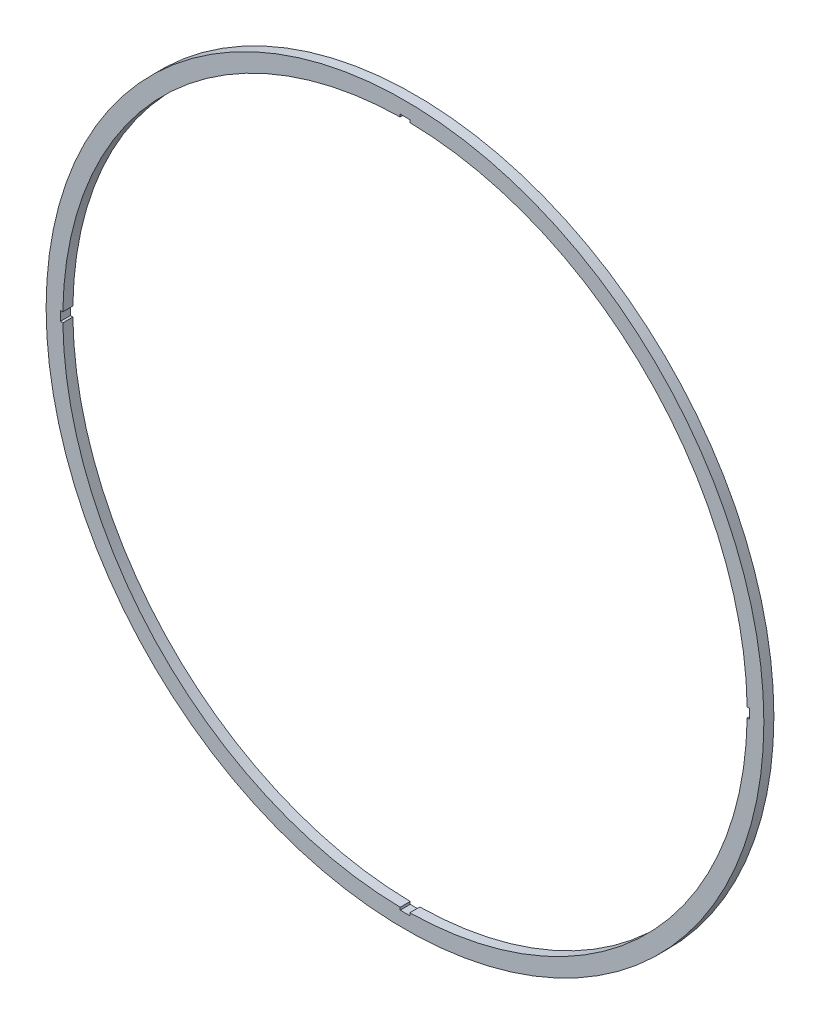
ISO-10303-21;
HEADER;
FILE_DESCRIPTION(('STEP AP214'),'2;1');
FILE_NAME('part.step','',(''),(''),'','','');
FILE_SCHEMA(('AUTOMOTIVE_DESIGN { 1 0 10303 214 1 1 1 1 }'));
ENDSEC;
DATA;
#1=APPLICATION_CONTEXT('core data for automotive mechanical design processes');
#2=APPLICATION_PROTOCOL_DEFINITION('international standard','automotive_design',2000,#1);
#3=PRODUCT_CONTEXT('',#1,'mechanical');
#4=PRODUCT('Part','Part','',(#3));
#5=PRODUCT_RELATED_PRODUCT_CATEGORY('part','',(#4));
#6=PRODUCT_DEFINITION_FORMATION('','',#4);
#7=PRODUCT_DEFINITION_CONTEXT('part definition',#1,'design');
#8=PRODUCT_DEFINITION('design','',#6,#7);
#9=PRODUCT_DEFINITION_SHAPE('','',#8);
#10=(LENGTH_UNIT() NAMED_UNIT(*) SI_UNIT(.MILLI.,.METRE.));
#11=(NAMED_UNIT(*) PLANE_ANGLE_UNIT() SI_UNIT($,.RADIAN.));
#12=(NAMED_UNIT(*) SI_UNIT($,.STERADIAN.) SOLID_ANGLE_UNIT());
#13=UNCERTAINTY_MEASURE_WITH_UNIT(LENGTH_MEASURE(1.E-05),#10,'distance_accuracy_value','');
#14=(GEOMETRIC_REPRESENTATION_CONTEXT(3) GLOBAL_UNCERTAINTY_ASSIGNED_CONTEXT((#13)) GLOBAL_UNIT_ASSIGNED_CONTEXT((#10,
#11,#12)) REPRESENTATION_CONTEXT('',''));
#15=CARTESIAN_POINT('',(0.,0.,0.));
#16=DIRECTION('',(0.,0.,1.));
#17=DIRECTION('',(1.,0.,0.));
#18=AXIS2_PLACEMENT_3D('',#15,#16,#17);
#19=CARTESIAN_POINT('',(0.,0.,12.));
#20=DIRECTION('',(0.,0.,1.));
#21=DIRECTION('',(1.,0.,0.));
#22=AXIS2_PLACEMENT_3D('',#19,#20,#21);
#23=PLANE('',#22);
#24=CARTESIAN_POINT('',(0.,0.,12.));
#25=DIRECTION('',(0.,0.,1.));
#26=DIRECTION('',(1.,0.,0.));
#27=AXIS2_PLACEMENT_3D('',#24,#25,#26);
#28=CIRCLE('',#27,430.);
#29=CARTESIAN_POINT('',(430.,0.,12.));
#30=VERTEX_POINT('',#29);
#31=EDGE_CURVE('E11',#30,#30,#28,.T.);
#32=ORIENTED_EDGE('',*,*,#31,.T.);
#33=EDGE_LOOP('',(#32));
#34=FACE_BOUND('',#33,.T.);
#35=CARTESIAN_POINT('',(0.,0.,12.));
#36=DIRECTION('',(0.,0.,1.));
#37=DIRECTION('',(1.,0.,0.));
#38=AXIS2_PLACEMENT_3D('',#35,#36,#37);
#39=CIRCLE('',#38,410.);
#40=CARTESIAN_POINT('',(-5.72093023255806,409.960084590286,12.));
#41=VERTEX_POINT('',#40);
#42=CARTESIAN_POINT('',(-409.960084590286,5.72093023254026,12.));
#43=VERTEX_POINT('',#42);
#44=EDGE_CURVE('E162',#41,#43,#39,.T.);
#45=ORIENTED_EDGE('',*,*,#44,.F.);
#46=DIRECTION('',(0.,-1.,0.));
#47=VECTOR('',#46,1.);
#48=CARTESIAN_POINT('',(-5.7209302325581,413.001947093175,12.));
#49=LINE('',#48,#47);
#50=CARTESIAN_POINT('',(-5.7209302325581,413.001947093175,12.));
#51=VERTEX_POINT('',#50);
#52=EDGE_CURVE('E153',#51,#41,#49,.T.);
#53=ORIENTED_EDGE('',*,*,#52,.F.);
#54=DIRECTION('',(-1.,0.,0.));
#55=VECTOR('',#54,1.);
#56=CARTESIAN_POINT('',(-5.7209302325581,413.001947093175,12.));
#57=LINE('',#56,#55);
#58=CARTESIAN_POINT('',(5.72093023254033,413.001947093175,12.));
#59=VERTEX_POINT('',#58);
#60=EDGE_CURVE('E217',#59,#51,#57,.T.);
#61=ORIENTED_EDGE('',*,*,#60,.F.);
#62=DIRECTION('',(0.,1.,0.));
#63=VECTOR('',#62,1.);
#64=CARTESIAN_POINT('',(5.72093023254033,413.001947093175,12.));
#65=LINE('',#64,#63);
#66=CARTESIAN_POINT('',(5.72093023254033,409.960084590286,12.));
#67=VERTEX_POINT('',#66);
#68=EDGE_CURVE('E214',#67,#59,#65,.T.);
#69=ORIENTED_EDGE('',*,*,#68,.F.);
#70=CARTESIAN_POINT('',(0.,0.,12.));
#71=DIRECTION('',(0.,0.,1.));
#72=DIRECTION('',(1.,0.,0.));
#73=AXIS2_PLACEMENT_3D('',#70,#71,#72);
#74=CIRCLE('',#73,410.);
#75=CARTESIAN_POINT('',(409.960084590286,5.72093023255812,12.));
#76=VERTEX_POINT('',#75);
#77=EDGE_CURVE('E211',#76,#67,#74,.T.);
#78=ORIENTED_EDGE('',*,*,#77,.F.);
#79=DIRECTION('',(-1.,0.,0.));
#80=VECTOR('',#79,1.);
#81=CARTESIAN_POINT('',(413.001947093175,5.72093023255813,12.));
#82=LINE('',#81,#80);
#83=CARTESIAN_POINT('',(413.001947093175,5.72093023255813,12.));
#84=VERTEX_POINT('',#83);
#85=EDGE_CURVE('E208',#84,#76,#82,.T.);
#86=ORIENTED_EDGE('',*,*,#85,.F.);
#87=DIRECTION('',(0.,1.,0.));
#88=VECTOR('',#87,1.);
#89=CARTESIAN_POINT('',(413.001947093175,5.72093023255813,12.));
#90=LINE('',#89,#88);
#91=CARTESIAN_POINT('',(413.001947093175,-5.72093023254031,12.));
#92=VERTEX_POINT('',#91);
#93=EDGE_CURVE('E205',#92,#84,#90,.T.);
#94=ORIENTED_EDGE('',*,*,#93,.F.);
#95=DIRECTION('',(1.,0.,0.));
#96=VECTOR('',#95,1.);
#97=CARTESIAN_POINT('',(413.001947093175,-5.72093023254031,12.));
#98=LINE('',#97,#96);
#99=CARTESIAN_POINT('',(409.960084590286,-5.72093023254031,12.));
#100=VERTEX_POINT('',#99);
#101=EDGE_CURVE('E202',#100,#92,#98,.T.);
#102=ORIENTED_EDGE('',*,*,#101,.F.);
#103=CARTESIAN_POINT('',(0.,0.,12.));
#104=DIRECTION('',(0.,0.,1.));
#105=DIRECTION('',(1.,0.,0.));
#106=AXIS2_PLACEMENT_3D('',#103,#104,#105);
#107=CIRCLE('',#106,410.);
#108=CARTESIAN_POINT('',(5.7209302325582,-409.960084590286,12.));
#109=VERTEX_POINT('',#108);
#110=EDGE_CURVE('E199',#109,#100,#107,.T.);
#111=ORIENTED_EDGE('',*,*,#110,.F.);
#112=DIRECTION('',(0.,1.,0.));
#113=VECTOR('',#112,1.);
#114=CARTESIAN_POINT('',(5.72093023255815,-413.001947093175,12.));
#115=LINE('',#114,#113);
#116=CARTESIAN_POINT('',(5.72093023255815,-413.001947093175,12.));
#117=VERTEX_POINT('',#116);
#118=EDGE_CURVE('E196',#117,#109,#115,.T.);
#119=ORIENTED_EDGE('',*,*,#118,.F.);
#120=DIRECTION('',(1.,0.,0.));
#121=VECTOR('',#120,1.);
#122=CARTESIAN_POINT('',(5.72093023255815,-413.001947093175,12.));
#123=LINE('',#122,#121);
#124=CARTESIAN_POINT('',(-5.72093023254028,-413.001947093175,12.));
#125=VERTEX_POINT('',#124);
#126=EDGE_CURVE('E193',#125,#117,#123,.T.);
#127=ORIENTED_EDGE('',*,*,#126,.F.);
#128=DIRECTION('',(0.,-1.,0.));
#129=VECTOR('',#128,1.);
#130=CARTESIAN_POINT('',(-5.72093023254028,-413.001947093175,12.));
#131=LINE('',#130,#129);
#132=CARTESIAN_POINT('',(-5.72093023254028,-409.960084590286,12.));
#133=VERTEX_POINT('',#132);
#134=EDGE_CURVE('E190',#133,#125,#131,.T.);
#135=ORIENTED_EDGE('',*,*,#134,.F.);
#136=CARTESIAN_POINT('',(0.,0.,12.));
#137=DIRECTION('',(0.,0.,1.));
#138=DIRECTION('',(1.,0.,0.));
#139=AXIS2_PLACEMENT_3D('',#136,#137,#138);
#140=CIRCLE('',#139,410.);
#141=CARTESIAN_POINT('',(-409.960084590286,-5.72093023255804,12.));
#142=VERTEX_POINT('',#141);
#143=EDGE_CURVE('E187',#142,#133,#140,.T.);
#144=ORIENTED_EDGE('',*,*,#143,.F.);
#145=DIRECTION('',(1.,0.,0.));
#146=VECTOR('',#145,1.);
#147=CARTESIAN_POINT('',(-413.001947093175,-5.72093023255818,12.));
#148=LINE('',#147,#146);
#149=CARTESIAN_POINT('',(-413.001947093175,-5.72093023255818,12.));
#150=VERTEX_POINT('',#149);
#151=EDGE_CURVE('E184',#150,#142,#148,.T.);
#152=ORIENTED_EDGE('',*,*,#151,.F.);
#153=DIRECTION('',(0.,-1.,0.));
#154=VECTOR('',#153,1.);
#155=CARTESIAN_POINT('',(-413.001947093175,-5.72093023255818,12.));
#156=LINE('',#155,#154);
#157=CARTESIAN_POINT('',(-413.001947093175,5.72093023254026,12.));
#158=VERTEX_POINT('',#157);
#159=EDGE_CURVE('E179',#158,#150,#156,.T.);
#160=ORIENTED_EDGE('',*,*,#159,.F.);
#161=DIRECTION('',(-1.,0.,0.));
#162=VECTOR('',#161,1.);
#163=CARTESIAN_POINT('',(-413.001947093175,5.72093023254026,12.));
#164=LINE('',#163,#162);
#165=EDGE_CURVE('E175',#43,#158,#164,.T.);
#166=ORIENTED_EDGE('',*,*,#165,.F.);
#167=EDGE_LOOP('',(#45,#53,#61,#69,#78,#86,#94,#102,#111,#119,#127,#135,#144,#152,#160,#166));
#168=FACE_BOUND('',#167,.T.);
#169=ADVANCED_FACE('F39',(#34,#168),#23,.T.);
#170=CARTESIAN_POINT('',(0.,0.,0.));
#171=DIRECTION('',(0.,0.,1.));
#172=DIRECTION('',(1.,0.,0.));
#173=AXIS2_PLACEMENT_3D('',#170,#171,#172);
#174=PLANE('',#173);
#175=CARTESIAN_POINT('',(0.,0.,0.));
#176=DIRECTION('',(0.,0.,1.));
#177=DIRECTION('',(1.,0.,0.));
#178=AXIS2_PLACEMENT_3D('',#175,#176,#177);
#179=CIRCLE('',#178,430.);
#180=CARTESIAN_POINT('',(430.,0.,0.));
#181=VERTEX_POINT('',#180);
#182=EDGE_CURVE('E43',#181,#181,#179,.T.);
#183=ORIENTED_EDGE('',*,*,#182,.F.);
#184=EDGE_LOOP('',(#183));
#185=FACE_BOUND('',#184,.T.);
#186=DIRECTION('',(0.,-1.,0.));
#187=VECTOR('',#186,1.);
#188=CARTESIAN_POINT('',(-5.7209302325581,413.001947093175,0.));
#189=LINE('',#188,#187);
#190=CARTESIAN_POINT('',(-5.7209302325581,413.001947093175,0.));
#191=VERTEX_POINT('',#190);
#192=CARTESIAN_POINT('',(-5.72093023255806,409.960084590286,0.));
#193=VERTEX_POINT('',#192);
#194=EDGE_CURVE('E63',#191,#193,#189,.T.);
#195=ORIENTED_EDGE('',*,*,#194,.T.);
#196=CARTESIAN_POINT('',(0.,0.,0.));
#197=DIRECTION('',(0.,0.,1.));
#198=DIRECTION('',(1.,0.,0.));
#199=AXIS2_PLACEMENT_3D('',#196,#197,#198);
#200=CIRCLE('',#199,410.);
#201=CARTESIAN_POINT('',(-409.960084590286,5.72093023254026,0.));
#202=VERTEX_POINT('',#201);
#203=EDGE_CURVE('E169',#193,#202,#200,.T.);
#204=ORIENTED_EDGE('',*,*,#203,.T.);
#205=DIRECTION('',(-1.,0.,0.));
#206=VECTOR('',#205,1.);
#207=CARTESIAN_POINT('',(-413.001947093175,5.72093023254026,0.));
#208=LINE('',#207,#206);
#209=CARTESIAN_POINT('',(-413.001947093175,5.72093023254026,0.));
#210=VERTEX_POINT('',#209);
#211=EDGE_CURVE('E224',#202,#210,#208,.T.);
#212=ORIENTED_EDGE('',*,*,#211,.T.);
#213=DIRECTION('',(0.,-1.,0.));
#214=VECTOR('',#213,1.);
#215=CARTESIAN_POINT('',(-413.001947093175,-5.72093023255818,0.));
#216=LINE('',#215,#214);
#217=CARTESIAN_POINT('',(-413.001947093175,-5.72093023255818,0.));
#218=VERTEX_POINT('',#217);
#219=EDGE_CURVE('E228',#210,#218,#216,.T.);
#220=ORIENTED_EDGE('',*,*,#219,.T.);
#221=DIRECTION('',(1.,0.,0.));
#222=VECTOR('',#221,1.);
#223=CARTESIAN_POINT('',(-413.001947093175,-5.72093023255818,0.));
#224=LINE('',#223,#222);
#225=CARTESIAN_POINT('',(-409.960084590286,-5.72093023255804,0.));
#226=VERTEX_POINT('',#225);
#227=EDGE_CURVE('E232',#218,#226,#224,.T.);
#228=ORIENTED_EDGE('',*,*,#227,.T.);
#229=CARTESIAN_POINT('',(0.,0.,0.));
#230=DIRECTION('',(0.,0.,1.));
#231=DIRECTION('',(1.,0.,0.));
#232=AXIS2_PLACEMENT_3D('',#229,#230,#231);
#233=CIRCLE('',#232,410.);
#234=CARTESIAN_POINT('',(-5.72093023254028,-409.960084590286,0.));
#235=VERTEX_POINT('',#234);
#236=EDGE_CURVE('E236',#226,#235,#233,.T.);
#237=ORIENTED_EDGE('',*,*,#236,.T.);
#238=DIRECTION('',(0.,-1.,0.));
#239=VECTOR('',#238,1.);
#240=CARTESIAN_POINT('',(-5.72093023254028,-413.001947093175,0.));
#241=LINE('',#240,#239);
#242=CARTESIAN_POINT('',(-5.72093023254028,-413.001947093175,0.));
#243=VERTEX_POINT('',#242);
#244=EDGE_CURVE('E240',#235,#243,#241,.T.);
#245=ORIENTED_EDGE('',*,*,#244,.T.);
#246=DIRECTION('',(1.,0.,0.));
#247=VECTOR('',#246,1.);
#248=CARTESIAN_POINT('',(5.72093023255815,-413.001947093175,0.));
#249=LINE('',#248,#247);
#250=CARTESIAN_POINT('',(5.72093023255815,-413.001947093175,0.));
#251=VERTEX_POINT('',#250);
#252=EDGE_CURVE('E244',#243,#251,#249,.T.);
#253=ORIENTED_EDGE('',*,*,#252,.T.);
#254=DIRECTION('',(0.,1.,0.));
#255=VECTOR('',#254,1.);
#256=CARTESIAN_POINT('',(5.72093023255815,-413.001947093175,0.));
#257=LINE('',#256,#255);
#258=CARTESIAN_POINT('',(5.7209302325582,-409.960084590286,0.));
#259=VERTEX_POINT('',#258);
#260=EDGE_CURVE('E248',#251,#259,#257,.T.);
#261=ORIENTED_EDGE('',*,*,#260,.T.);
#262=CARTESIAN_POINT('',(0.,0.,0.));
#263=DIRECTION('',(0.,0.,1.));
#264=DIRECTION('',(1.,0.,0.));
#265=AXIS2_PLACEMENT_3D('',#262,#263,#264);
#266=CIRCLE('',#265,410.);
#267=CARTESIAN_POINT('',(409.960084590286,-5.72093023254031,0.));
#268=VERTEX_POINT('',#267);
#269=EDGE_CURVE('E252',#259,#268,#266,.T.);
#270=ORIENTED_EDGE('',*,*,#269,.T.);
#271=DIRECTION('',(1.,0.,0.));
#272=VECTOR('',#271,1.);
#273=CARTESIAN_POINT('',(413.001947093175,-5.72093023254031,0.));
#274=LINE('',#273,#272);
#275=CARTESIAN_POINT('',(413.001947093175,-5.72093023254031,0.));
#276=VERTEX_POINT('',#275);
#277=EDGE_CURVE('E256',#268,#276,#274,.T.);
#278=ORIENTED_EDGE('',*,*,#277,.T.);
#279=DIRECTION('',(0.,1.,0.));
#280=VECTOR('',#279,1.);
#281=CARTESIAN_POINT('',(413.001947093175,5.72093023255813,0.));
#282=LINE('',#281,#280);
#283=CARTESIAN_POINT('',(413.001947093175,5.72093023255813,0.));
#284=VERTEX_POINT('',#283);
#285=EDGE_CURVE('E260',#276,#284,#282,.T.);
#286=ORIENTED_EDGE('',*,*,#285,.T.);
#287=DIRECTION('',(-1.,0.,0.));
#288=VECTOR('',#287,1.);
#289=CARTESIAN_POINT('',(413.001947093175,5.72093023255813,0.));
#290=LINE('',#289,#288);
#291=CARTESIAN_POINT('',(409.960084590286,5.72093023255812,0.));
#292=VERTEX_POINT('',#291);
#293=EDGE_CURVE('E264',#284,#292,#290,.T.);
#294=ORIENTED_EDGE('',*,*,#293,.T.);
#295=CARTESIAN_POINT('',(0.,0.,0.));
#296=DIRECTION('',(0.,0.,1.));
#297=DIRECTION('',(1.,0.,0.));
#298=AXIS2_PLACEMENT_3D('',#295,#296,#297);
#299=CIRCLE('',#298,410.);
#300=CARTESIAN_POINT('',(5.72093023254033,409.960084590286,0.));
#301=VERTEX_POINT('',#300);
#302=EDGE_CURVE('E268',#292,#301,#299,.T.);
#303=ORIENTED_EDGE('',*,*,#302,.T.);
#304=DIRECTION('',(0.,1.,0.));
#305=VECTOR('',#304,1.);
#306=CARTESIAN_POINT('',(5.72093023254033,413.001947093175,0.));
#307=LINE('',#306,#305);
#308=CARTESIAN_POINT('',(5.72093023254033,413.001947093175,0.));
#309=VERTEX_POINT('',#308);
#310=EDGE_CURVE('E272',#301,#309,#307,.T.);
#311=ORIENTED_EDGE('',*,*,#310,.T.);
#312=DIRECTION('',(-1.,0.,0.));
#313=VECTOR('',#312,1.);
#314=CARTESIAN_POINT('',(-5.7209302325581,413.001947093175,0.));
#315=LINE('',#314,#313);
#316=EDGE_CURVE('E163',#309,#191,#315,.T.);
#317=ORIENTED_EDGE('',*,*,#316,.T.);
#318=EDGE_LOOP('',(#195,#204,#212,#220,#228,#237,#245,#253,#261,#270,#278,#286,#294,#303,#311,#317));
#319=FACE_BOUND('',#318,.T.);
#320=ADVANCED_FACE('F326',(#185,#319),#174,.F.);
#321=CARTESIAN_POINT('',(0.,0.,12.));
#322=DIRECTION('',(0.,0.,-1.));
#323=DIRECTION('',(-1.,0.,0.));
#324=AXIS2_PLACEMENT_3D('',#321,#322,#323);
#325=CYLINDRICAL_SURFACE('',#324,430.);
#326=ORIENTED_EDGE('',*,*,#31,.F.);
#327=EDGE_LOOP('',(#326));
#328=FACE_BOUND('',#327,.T.);
#329=ORIENTED_EDGE('',*,*,#182,.T.);
#330=EDGE_LOOP('',(#329));
#331=FACE_BOUND('',#330,.T.);
#332=ADVANCED_FACE('F41',(#328,#331),#325,.T.);
#333=CARTESIAN_POINT('',(-5.7209302325581,413.001947093175,12.));
#334=DIRECTION('',(1.,0.,0.));
#335=DIRECTION('',(0.,0.,-1.));
#336=AXIS2_PLACEMENT_3D('',#333,#334,#335);
#337=PLANE('',#336);
#338=ORIENTED_EDGE('',*,*,#194,.F.);
#339=DIRECTION('',(0.,0.,-1.));
#340=VECTOR('',#339,1.);
#341=CARTESIAN_POINT('',(-5.7209302325581,413.001947093175,12.));
#342=LINE('',#341,#340);
#343=EDGE_CURVE('E157',#51,#191,#342,.T.);
#344=ORIENTED_EDGE('',*,*,#343,.F.);
#345=ORIENTED_EDGE('',*,*,#52,.T.);
#346=DIRECTION('',(0.,0.,-1.));
#347=VECTOR('',#346,1.);
#348=CARTESIAN_POINT('',(-5.72093023255806,409.960084590286,12.));
#349=LINE('',#348,#347);
#350=EDGE_CURVE('E156',#41,#193,#349,.T.);
#351=ORIENTED_EDGE('',*,*,#350,.T.);
#352=EDGE_LOOP('',(#338,#344,#345,#351));
#353=FACE_BOUND('',#352,.T.);
#354=ADVANCED_FACE('F155',(#353),#337,.T.);
#355=CARTESIAN_POINT('',(0.,0.,12.));
#356=DIRECTION('',(0.,0.,-1.));
#357=DIRECTION('',(-1.,0.,0.));
#358=AXIS2_PLACEMENT_3D('',#355,#356,#357);
#359=CYLINDRICAL_SURFACE('',#358,410.);
#360=ORIENTED_EDGE('',*,*,#203,.F.);
#361=ORIENTED_EDGE('',*,*,#350,.F.);
#362=ORIENTED_EDGE('',*,*,#44,.T.);
#363=DIRECTION('',(0.,0.,-1.));
#364=VECTOR('',#363,1.);
#365=CARTESIAN_POINT('',(-409.960084590286,5.72093023254026,12.));
#366=LINE('',#365,#364);
#367=EDGE_CURVE('E171',#43,#202,#366,.T.);
#368=ORIENTED_EDGE('',*,*,#367,.T.);
#369=EDGE_LOOP('',(#360,#361,#362,#368));
#370=FACE_BOUND('',#369,.T.);
#371=ADVANCED_FACE('F166',(#370),#359,.F.);
#372=CARTESIAN_POINT('',(-413.001947093175,5.72093023254026,12.));
#373=DIRECTION('',(0.,-1.,0.));
#374=DIRECTION('',(1.,0.,0.));
#375=AXIS2_PLACEMENT_3D('',#372,#373,#374);
#376=PLANE('',#375);
#377=ORIENTED_EDGE('',*,*,#211,.F.);
#378=ORIENTED_EDGE('',*,*,#367,.F.);
#379=ORIENTED_EDGE('',*,*,#165,.T.);
#380=DIRECTION('',(0.,0.,-1.));
#381=VECTOR('',#380,1.);
#382=CARTESIAN_POINT('',(-413.001947093175,5.72093023254026,12.));
#383=LINE('',#382,#381);
#384=EDGE_CURVE('E316',#158,#210,#383,.T.);
#385=ORIENTED_EDGE('',*,*,#384,.T.);
#386=EDGE_LOOP('',(#377,#378,#379,#385));
#387=FACE_BOUND('',#386,.T.);
#388=ADVANCED_FACE('F322',(#387),#376,.T.);
#389=CARTESIAN_POINT('',(-413.001947093175,-5.72093023255818,12.));
#390=DIRECTION('',(1.,0.,0.));
#391=DIRECTION('',(0.,0.,-1.));
#392=AXIS2_PLACEMENT_3D('',#389,#390,#391);
#393=PLANE('',#392);
#394=ORIENTED_EDGE('',*,*,#219,.F.);
#395=ORIENTED_EDGE('',*,*,#384,.F.);
#396=ORIENTED_EDGE('',*,*,#159,.T.);
#397=DIRECTION('',(0.,0.,-1.));
#398=VECTOR('',#397,1.);
#399=CARTESIAN_POINT('',(-413.001947093175,-5.72093023255818,12.));
#400=LINE('',#399,#398);
#401=EDGE_CURVE('E313',#150,#218,#400,.T.);
#402=ORIENTED_EDGE('',*,*,#401,.T.);
#403=EDGE_LOOP('',(#394,#395,#396,#402));
#404=FACE_BOUND('',#403,.T.);
#405=ADVANCED_FACE('F384',(#404),#393,.T.);
#406=CARTESIAN_POINT('',(-413.001947093175,-5.72093023255818,12.));
#407=DIRECTION('',(0.,1.,0.));
#408=DIRECTION('',(-1.,0.,0.));
#409=AXIS2_PLACEMENT_3D('',#406,#407,#408);
#410=PLANE('',#409);
#411=ORIENTED_EDGE('',*,*,#227,.F.);
#412=ORIENTED_EDGE('',*,*,#401,.F.);
#413=ORIENTED_EDGE('',*,*,#151,.T.);
#414=DIRECTION('',(0.,0.,-1.));
#415=VECTOR('',#414,1.);
#416=CARTESIAN_POINT('',(-409.960084590286,-5.72093023255804,12.));
#417=LINE('',#416,#415);
#418=EDGE_CURVE('E310',#142,#226,#417,.T.);
#419=ORIENTED_EDGE('',*,*,#418,.T.);
#420=EDGE_LOOP('',(#411,#412,#413,#419));
#421=FACE_BOUND('',#420,.T.);
#422=ADVANCED_FACE('F381',(#421),#410,.T.);
#423=CARTESIAN_POINT('',(0.,0.,12.));
#424=DIRECTION('',(0.,0.,-1.));
#425=DIRECTION('',(-1.,0.,0.));
#426=AXIS2_PLACEMENT_3D('',#423,#424,#425);
#427=CYLINDRICAL_SURFACE('',#426,410.);
#428=ORIENTED_EDGE('',*,*,#236,.F.);
#429=ORIENTED_EDGE('',*,*,#418,.F.);
#430=ORIENTED_EDGE('',*,*,#143,.T.);
#431=DIRECTION('',(0.,0.,-1.));
#432=VECTOR('',#431,1.);
#433=CARTESIAN_POINT('',(-5.72093023254028,-409.960084590286,12.));
#434=LINE('',#433,#432);
#435=EDGE_CURVE('E307',#133,#235,#434,.T.);
#436=ORIENTED_EDGE('',*,*,#435,.T.);
#437=EDGE_LOOP('',(#428,#429,#430,#436));
#438=FACE_BOUND('',#437,.T.);
#439=ADVANCED_FACE('F378',(#438),#427,.F.);
#440=CARTESIAN_POINT('',(-5.72093023254028,-413.001947093175,12.));
#441=DIRECTION('',(1.,0.,0.));
#442=DIRECTION('',(0.,1.,0.));
#443=AXIS2_PLACEMENT_3D('',#440,#441,#442);
#444=PLANE('',#443);
#445=ORIENTED_EDGE('',*,*,#244,.F.);
#446=ORIENTED_EDGE('',*,*,#435,.F.);
#447=ORIENTED_EDGE('',*,*,#134,.T.);
#448=DIRECTION('',(0.,0.,-1.));
#449=VECTOR('',#448,1.);
#450=CARTESIAN_POINT('',(-5.72093023254028,-413.001947093175,12.));
#451=LINE('',#450,#449);
#452=EDGE_CURVE('E304',#125,#243,#451,.T.);
#453=ORIENTED_EDGE('',*,*,#452,.T.);
#454=EDGE_LOOP('',(#445,#446,#447,#453));
#455=FACE_BOUND('',#454,.T.);
#456=ADVANCED_FACE('F371',(#455),#444,.T.);
#457=CARTESIAN_POINT('',(5.72093023255815,-413.001947093175,12.));
#458=DIRECTION('',(0.,1.,0.));
#459=DIRECTION('',(0.,0.,1.));
#460=AXIS2_PLACEMENT_3D('',#457,#458,#459);
#461=PLANE('',#460);
#462=ORIENTED_EDGE('',*,*,#252,.F.);
#463=ORIENTED_EDGE('',*,*,#452,.F.);
#464=ORIENTED_EDGE('',*,*,#126,.T.);
#465=DIRECTION('',(0.,0.,-1.));
#466=VECTOR('',#465,1.);
#467=CARTESIAN_POINT('',(5.72093023255815,-413.001947093175,12.));
#468=LINE('',#467,#466);
#469=EDGE_CURVE('E301',#117,#251,#468,.T.);
#470=ORIENTED_EDGE('',*,*,#469,.T.);
#471=EDGE_LOOP('',(#462,#463,#464,#470));
#472=FACE_BOUND('',#471,.T.);
#473=ADVANCED_FACE('F367',(#472),#461,.T.);
#474=CARTESIAN_POINT('',(5.72093023255815,-413.001947093175,12.));
#475=DIRECTION('',(-1.,0.,0.));
#476=DIRECTION('',(0.,-1.,0.));
#477=AXIS2_PLACEMENT_3D('',#474,#475,#476);
#478=PLANE('',#477);
#479=ORIENTED_EDGE('',*,*,#260,.F.);
#480=ORIENTED_EDGE('',*,*,#469,.F.);
#481=ORIENTED_EDGE('',*,*,#118,.T.);
#482=DIRECTION('',(0.,0.,-1.));
#483=VECTOR('',#482,1.);
#484=CARTESIAN_POINT('',(5.7209302325582,-409.960084590286,12.));
#485=LINE('',#484,#483);
#486=EDGE_CURVE('E298',#109,#259,#485,.T.);
#487=ORIENTED_EDGE('',*,*,#486,.T.);
#488=EDGE_LOOP('',(#479,#480,#481,#487));
#489=FACE_BOUND('',#488,.T.);
#490=ADVANCED_FACE('F364',(#489),#478,.T.);
#491=CARTESIAN_POINT('',(0.,0.,12.));
#492=DIRECTION('',(0.,0.,-1.));
#493=DIRECTION('',(-1.,0.,0.));
#494=AXIS2_PLACEMENT_3D('',#491,#492,#493);
#495=CYLINDRICAL_SURFACE('',#494,410.);
#496=ORIENTED_EDGE('',*,*,#269,.F.);
#497=ORIENTED_EDGE('',*,*,#486,.F.);
#498=ORIENTED_EDGE('',*,*,#110,.T.);
#499=DIRECTION('',(0.,0.,-1.));
#500=VECTOR('',#499,1.);
#501=CARTESIAN_POINT('',(409.960084590286,-5.72093023254031,12.));
#502=LINE('',#501,#500);
#503=EDGE_CURVE('E295',#100,#268,#502,.T.);
#504=ORIENTED_EDGE('',*,*,#503,.T.);
#505=EDGE_LOOP('',(#496,#497,#498,#504));
#506=FACE_BOUND('',#505,.T.);
#507=ADVANCED_FACE('F356',(#506),#495,.F.);
#508=CARTESIAN_POINT('',(413.001947093175,-5.72093023254031,12.));
#509=DIRECTION('',(0.,1.,0.));
#510=DIRECTION('',(-1.,0.,0.));
#511=AXIS2_PLACEMENT_3D('',#508,#509,#510);
#512=PLANE('',#511);
#513=ORIENTED_EDGE('',*,*,#277,.F.);
#514=ORIENTED_EDGE('',*,*,#503,.F.);
#515=ORIENTED_EDGE('',*,*,#101,.T.);
#516=DIRECTION('',(0.,0.,-1.));
#517=VECTOR('',#516,1.);
#518=CARTESIAN_POINT('',(413.001947093175,-5.72093023254031,12.));
#519=LINE('',#518,#517);
#520=EDGE_CURVE('E292',#92,#276,#519,.T.);
#521=ORIENTED_EDGE('',*,*,#520,.T.);
#522=EDGE_LOOP('',(#513,#514,#515,#521));
#523=FACE_BOUND('',#522,.T.);
#524=ADVANCED_FACE('F352',(#523),#512,.T.);
#525=CARTESIAN_POINT('',(413.001947093175,5.72093023255813,12.));
#526=DIRECTION('',(-1.,0.,0.));
#527=DIRECTION('',(0.,0.,1.));
#528=AXIS2_PLACEMENT_3D('',#525,#526,#527);
#529=PLANE('',#528);
#530=ORIENTED_EDGE('',*,*,#285,.F.);
#531=ORIENTED_EDGE('',*,*,#520,.F.);
#532=ORIENTED_EDGE('',*,*,#93,.T.);
#533=DIRECTION('',(0.,0.,-1.));
#534=VECTOR('',#533,1.);
#535=CARTESIAN_POINT('',(413.001947093175,5.72093023255813,12.));
#536=LINE('',#535,#534);
#537=EDGE_CURVE('E289',#84,#284,#536,.T.);
#538=ORIENTED_EDGE('',*,*,#537,.T.);
#539=EDGE_LOOP('',(#530,#531,#532,#538));
#540=FACE_BOUND('',#539,.T.);
#541=ADVANCED_FACE('F349',(#540),#529,.T.);
#542=CARTESIAN_POINT('',(413.001947093175,5.72093023255813,12.));
#543=DIRECTION('',(0.,-1.,0.));
#544=DIRECTION('',(0.,0.,-1.));
#545=AXIS2_PLACEMENT_3D('',#542,#543,#544);
#546=PLANE('',#545);
#547=ORIENTED_EDGE('',*,*,#293,.F.);
#548=ORIENTED_EDGE('',*,*,#537,.F.);
#549=ORIENTED_EDGE('',*,*,#85,.T.);
#550=DIRECTION('',(0.,0.,-1.));
#551=VECTOR('',#550,1.);
#552=CARTESIAN_POINT('',(409.960084590286,5.72093023255812,12.));
#553=LINE('',#552,#551);
#554=EDGE_CURVE('E286',#76,#292,#553,.T.);
#555=ORIENTED_EDGE('',*,*,#554,.T.);
#556=EDGE_LOOP('',(#547,#548,#549,#555));
#557=FACE_BOUND('',#556,.T.);
#558=ADVANCED_FACE('F341',(#557),#546,.T.);
#559=CARTESIAN_POINT('',(0.,0.,12.));
#560=DIRECTION('',(0.,0.,-1.));
#561=DIRECTION('',(-1.,0.,0.));
#562=AXIS2_PLACEMENT_3D('',#559,#560,#561);
#563=CYLINDRICAL_SURFACE('',#562,410.);
#564=ORIENTED_EDGE('',*,*,#302,.F.);
#565=ORIENTED_EDGE('',*,*,#554,.F.);
#566=ORIENTED_EDGE('',*,*,#77,.T.);
#567=DIRECTION('',(0.,0.,-1.));
#568=VECTOR('',#567,1.);
#569=CARTESIAN_POINT('',(5.72093023254033,409.960084590286,12.));
#570=LINE('',#569,#568);
#571=EDGE_CURVE('E283',#67,#301,#570,.T.);
#572=ORIENTED_EDGE('',*,*,#571,.T.);
#573=EDGE_LOOP('',(#564,#565,#566,#572));
#574=FACE_BOUND('',#573,.T.);
#575=ADVANCED_FACE('F337',(#574),#563,.F.);
#576=CARTESIAN_POINT('',(5.72093023254033,413.001947093175,12.));
#577=DIRECTION('',(-1.,0.,0.));
#578=DIRECTION('',(0.,-1.,0.));
#579=AXIS2_PLACEMENT_3D('',#576,#577,#578);
#580=PLANE('',#579);
#581=ORIENTED_EDGE('',*,*,#310,.F.);
#582=ORIENTED_EDGE('',*,*,#571,.F.);
#583=ORIENTED_EDGE('',*,*,#68,.T.);
#584=DIRECTION('',(0.,0.,-1.));
#585=VECTOR('',#584,1.);
#586=CARTESIAN_POINT('',(5.72093023254033,413.001947093175,12.));
#587=LINE('',#586,#585);
#588=EDGE_CURVE('E55',#59,#309,#587,.T.);
#589=ORIENTED_EDGE('',*,*,#588,.T.);
#590=EDGE_LOOP('',(#581,#582,#583,#589));
#591=FACE_BOUND('',#590,.T.);
#592=ADVANCED_FACE('F334',(#591),#580,.T.);
#593=CARTESIAN_POINT('',(-5.7209302325581,413.001947093175,12.));
#594=DIRECTION('',(0.,-1.,0.));
#595=DIRECTION('',(0.,0.,-1.));
#596=AXIS2_PLACEMENT_3D('',#593,#594,#595);
#597=PLANE('',#596);
#598=ORIENTED_EDGE('',*,*,#316,.F.);
#599=ORIENTED_EDGE('',*,*,#588,.F.);
#600=ORIENTED_EDGE('',*,*,#60,.T.);
#601=ORIENTED_EDGE('',*,*,#343,.T.);
#602=EDGE_LOOP('',(#598,#599,#600,#601));
#603=FACE_BOUND('',#602,.T.);
#604=ADVANCED_FACE('F328',(#603),#597,.T.);
#605=CLOSED_SHELL('',(#169,#320,#332,#354,#371,#388,#405,#422,#439,#456,#473,#490,#507,#524,
#541,#558,#575,#592,#604));
#606=MANIFOLD_SOLID_BREP('B2',#605);
#607=ADVANCED_BREP_SHAPE_REPRESENTATION('',(#18,#606),#14);
#608=SHAPE_DEFINITION_REPRESENTATION(#9,#607);
ENDSEC;
END-ISO-10303-21;
